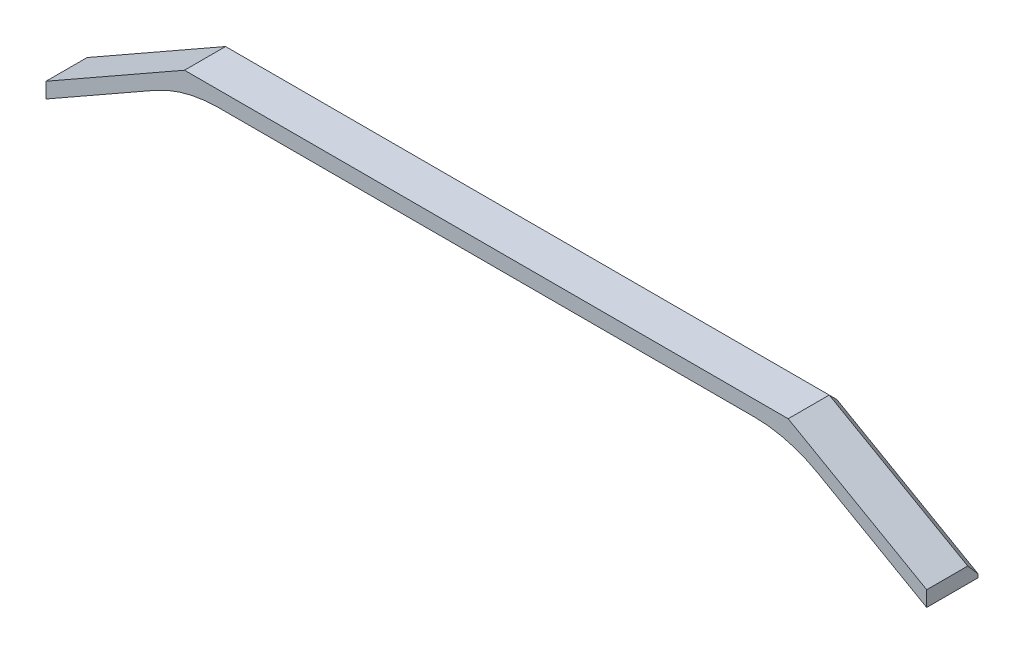
ISO-10303-21;
HEADER;
FILE_DESCRIPTION(('STEP AP214'),'2;1');
FILE_NAME('part.step','',(''),(''),'','','');
FILE_SCHEMA(('AUTOMOTIVE_DESIGN { 1 0 10303 214 1 1 1 1 }'));
ENDSEC;
DATA;
#1=APPLICATION_CONTEXT('core data for automotive mechanical design processes');
#2=APPLICATION_PROTOCOL_DEFINITION('international standard','automotive_design',2000,#1);
#3=PRODUCT_CONTEXT('',#1,'mechanical');
#4=PRODUCT('Part','Part','',(#3));
#5=PRODUCT_RELATED_PRODUCT_CATEGORY('part','',(#4));
#6=PRODUCT_DEFINITION_FORMATION('','',#4);
#7=PRODUCT_DEFINITION_CONTEXT('part definition',#1,'design');
#8=PRODUCT_DEFINITION('design','',#6,#7);
#9=PRODUCT_DEFINITION_SHAPE('','',#8);
#10=(LENGTH_UNIT() NAMED_UNIT(*) SI_UNIT(.MILLI.,.METRE.));
#11=(NAMED_UNIT(*) PLANE_ANGLE_UNIT() SI_UNIT($,.RADIAN.));
#12=(NAMED_UNIT(*) SI_UNIT($,.STERADIAN.) SOLID_ANGLE_UNIT());
#13=UNCERTAINTY_MEASURE_WITH_UNIT(LENGTH_MEASURE(1.E-05),#10,'distance_accuracy_value','');
#14=(GEOMETRIC_REPRESENTATION_CONTEXT(3) GLOBAL_UNCERTAINTY_ASSIGNED_CONTEXT((#13)) GLOBAL_UNIT_ASSIGNED_CONTEXT((#10,
#11,#12)) REPRESENTATION_CONTEXT('',''));
#15=CARTESIAN_POINT('',(0.,0.,0.));
#16=DIRECTION('',(0.,0.,1.));
#17=DIRECTION('',(1.,0.,0.));
#18=AXIS2_PLACEMENT_3D('',#15,#16,#17);
#19=CARTESIAN_POINT('',(-58.8301277383861,3.,-9.99999999999999));
#20=DIRECTION('',(0.,0.,1.));
#21=DIRECTION('',(1.,0.,0.));
#22=AXIS2_PLACEMENT_3D('',#19,#20,#21);
#23=PLANE('',#22);
#24=DIRECTION('',(1.,0.,0.));
#25=VECTOR('',#24,1.);
#26=CARTESIAN_POINT('',(-58.8301277383861,0.999999999999998,-9.99999999999999));
#27=LINE('',#26,#25);
#28=CARTESIAN_POINT('',(-58.3010030599565,0.999999999999998,-9.99999999999999));
#29=VERTEX_POINT('',#28);
#30=CARTESIAN_POINT('',(58.3010030599564,0.999999999999998,-10.));
#31=VERTEX_POINT('',#30);
#32=EDGE_CURVE('E197',#29,#31,#27,.T.);
#33=ORIENTED_EDGE('',*,*,#32,.T.);
#34=DIRECTION('',(0.869170702615036,-0.494512173475725,0.));
#35=VECTOR('',#34,1.);
#36=CARTESIAN_POINT('',(84.8411033914347,-14.0999138140486,-10.));
#37=LINE('',#36,#35);
#38=CARTESIAN_POINT('',(85.8301277383861,-14.6626163740405,-10.));
#39=VERTEX_POINT('',#38);
#40=EDGE_CURVE('E221',#31,#39,#37,.T.);
#41=ORIENTED_EDGE('',*,*,#40,.T.);
#42=DIRECTION('',(0.,1.,0.));
#43=VECTOR('',#42,1.);
#44=CARTESIAN_POINT('',(85.8301277383861,-15.3615724088186,-10.));
#45=LINE('',#44,#43);
#46=CARTESIAN_POINT('',(85.8301277383861,-15.3615724088186,-10.));
#47=VERTEX_POINT('',#46);
#48=EDGE_CURVE('E157',#47,#39,#45,.T.);
#49=ORIENTED_EDGE('',*,*,#48,.F.);
#50=DIRECTION('',(0.869170702615036,-0.494512173475725,0.));
#51=VECTOR('',#50,1.);
#52=CARTESIAN_POINT('',(58.8301277383861,0.,-10.));
#53=LINE('',#52,#51);
#54=CARTESIAN_POINT('',(64.5788735949077,-3.27073243462411,-10.));
#55=VERTEX_POINT('',#54);
#56=EDGE_CURVE('E154',#55,#47,#53,.T.);
#57=ORIENTED_EDGE('',*,*,#56,.F.);
#58=CARTESIAN_POINT('',(52.2160692580145,-25.,-10.));
#59=DIRECTION('',(0.,0.,1.));
#60=DIRECTION('',(1.,0.,0.));
#61=AXIS2_PLACEMENT_3D('',#58,#59,#60);
#62=CIRCLE('',#61,25.);
#63=CARTESIAN_POINT('',(52.2160692580145,0.,-10.));
#64=VERTEX_POINT('',#63);
#65=EDGE_CURVE('E47',#55,#64,#62,.T.);
#66=ORIENTED_EDGE('',*,*,#65,.T.);
#67=DIRECTION('',(-1.,0.,0.));
#68=VECTOR('',#67,1.);
#69=CARTESIAN_POINT('',(-58.8301277383861,0.,-9.99999999999999));
#70=LINE('',#69,#68);
#71=CARTESIAN_POINT('',(-52.2160692580145,0.,-9.99999999999999));
#72=VERTEX_POINT('',#71);
#73=EDGE_CURVE('E184',#64,#72,#70,.T.);
#74=ORIENTED_EDGE('',*,*,#73,.T.);
#75=CARTESIAN_POINT('',(-52.2160692580145,-25.,-9.99999999999999));
#76=DIRECTION('',(0.,0.,1.));
#77=DIRECTION('',(1.,0.,0.));
#78=AXIS2_PLACEMENT_3D('',#75,#76,#77);
#79=CIRCLE('',#78,25.);
#80=CARTESIAN_POINT('',(-64.5788735949077,-3.27073243462411,-10.));
#81=VERTEX_POINT('',#80);
#82=EDGE_CURVE('E240',#72,#81,#79,.T.);
#83=ORIENTED_EDGE('',*,*,#82,.T.);
#84=DIRECTION('',(0.869170702615035,0.494512173475725,0.));
#85=VECTOR('',#84,1.);
#86=CARTESIAN_POINT('',(-58.8301277383861,0.,-10.));
#87=LINE('',#86,#85);
#88=CARTESIAN_POINT('',(-85.8301277383861,-15.3615724088186,-10.));
#89=VERTEX_POINT('',#88);
#90=EDGE_CURVE('E164',#89,#81,#87,.T.);
#91=ORIENTED_EDGE('',*,*,#90,.F.);
#92=DIRECTION('',(0.,-1.,0.));
#93=VECTOR('',#92,1.);
#94=CARTESIAN_POINT('',(-85.8301277383861,-15.3615724088186,-10.));
#95=LINE('',#94,#93);
#96=CARTESIAN_POINT('',(-85.8301277383861,-14.6626163740404,-10.));
#97=VERTEX_POINT('',#96);
#98=EDGE_CURVE('E162',#97,#89,#95,.T.);
#99=ORIENTED_EDGE('',*,*,#98,.F.);
#100=DIRECTION('',(0.869170702615035,0.494512173475725,0.));
#101=VECTOR('',#100,1.);
#102=CARTESIAN_POINT('',(-57.8411033914347,1.26165859476996,-9.99999999999999));
#103=LINE('',#102,#101);
#104=EDGE_CURVE('E219',#97,#29,#103,.T.);
#105=ORIENTED_EDGE('',*,*,#104,.T.);
#106=EDGE_LOOP('',(#33,#41,#49,#57,#66,#74,#83,#91,#99,#105));
#107=FACE_BOUND('',#106,.T.);
#108=ADVANCED_FACE('F39',(#107),#23,.F.);
#109=CARTESIAN_POINT('',(58.8301277383861,3.,0.));
#110=DIRECTION('',(0.,0.,-1.));
#111=DIRECTION('',(-1.,0.,0.));
#112=AXIS2_PLACEMENT_3D('',#109,#110,#111);
#113=PLANE('',#112);
#114=DIRECTION('',(0.869170702615035,0.494512173475725,0.));
#115=VECTOR('',#114,1.);
#116=CARTESIAN_POINT('',(-58.8301277383861,0.,0.));
#117=LINE('',#116,#115);
#118=CARTESIAN_POINT('',(-85.8301277383861,-15.3615724088186,0.));
#119=VERTEX_POINT('',#118);
#120=CARTESIAN_POINT('',(-64.5788735949077,-3.27073243462411,0.));
#121=VERTEX_POINT('',#120);
#122=EDGE_CURVE('E165',#119,#121,#117,.T.);
#123=ORIENTED_EDGE('',*,*,#122,.T.);
#124=CARTESIAN_POINT('',(-52.2160692580145,-25.,0.));
#125=DIRECTION('',(0.,0.,-1.));
#126=DIRECTION('',(-1.,0.,0.));
#127=AXIS2_PLACEMENT_3D('',#124,#125,#126);
#128=CIRCLE('',#127,25.);
#129=CARTESIAN_POINT('',(-52.2160692580145,0.,0.));
#130=VERTEX_POINT('',#129);
#131=EDGE_CURVE('E238',#121,#130,#128,.T.);
#132=ORIENTED_EDGE('',*,*,#131,.T.);
#133=DIRECTION('',(1.,0.,0.));
#134=VECTOR('',#133,1.);
#135=CARTESIAN_POINT('',(58.8301277383861,0.,0.));
#136=LINE('',#135,#134);
#137=CARTESIAN_POINT('',(52.2160692580145,0.,0.));
#138=VERTEX_POINT('',#137);
#139=EDGE_CURVE('E187',#130,#138,#136,.T.);
#140=ORIENTED_EDGE('',*,*,#139,.T.);
#141=CARTESIAN_POINT('',(52.2160692580145,-25.,0.));
#142=DIRECTION('',(0.,0.,-1.));
#143=DIRECTION('',(-1.,0.,0.));
#144=AXIS2_PLACEMENT_3D('',#141,#142,#143);
#145=CIRCLE('',#144,25.);
#146=CARTESIAN_POINT('',(64.5788735949077,-3.27073243462411,0.));
#147=VERTEX_POINT('',#146);
#148=EDGE_CURVE('E11',#138,#147,#145,.T.);
#149=ORIENTED_EDGE('',*,*,#148,.T.);
#150=DIRECTION('',(0.869170702615036,-0.494512173475725,0.));
#151=VECTOR('',#150,1.);
#152=CARTESIAN_POINT('',(58.8301277383861,0.,0.));
#153=LINE('',#152,#151);
#154=CARTESIAN_POINT('',(85.8301277383861,-15.3615724088186,0.));
#155=VERTEX_POINT('',#154);
#156=EDGE_CURVE('E149',#147,#155,#153,.T.);
#157=ORIENTED_EDGE('',*,*,#156,.T.);
#158=DIRECTION('',(0.,1.,0.));
#159=VECTOR('',#158,1.);
#160=CARTESIAN_POINT('',(85.8301277383861,-15.3615724088186,0.));
#161=LINE('',#160,#159);
#162=CARTESIAN_POINT('',(85.8301277383861,-12.3615724088186,0.));
#163=VERTEX_POINT('',#162);
#164=EDGE_CURVE('E133',#155,#163,#161,.T.);
#165=ORIENTED_EDGE('',*,*,#164,.T.);
#166=DIRECTION('',(-0.869170702615035,0.494512173475725,0.));
#167=VECTOR('',#166,1.);
#168=CARTESIAN_POINT('',(85.8301277383861,-12.3615724088186,0.));
#169=LINE('',#168,#167);
#170=CARTESIAN_POINT('',(58.8301277383861,3.,0.));
#171=VERTEX_POINT('',#170);
#172=EDGE_CURVE('E143',#163,#171,#169,.T.);
#173=ORIENTED_EDGE('',*,*,#172,.T.);
#174=DIRECTION('',(1.,0.,0.));
#175=VECTOR('',#174,1.);
#176=CARTESIAN_POINT('',(58.8301277383861,3.,0.));
#177=LINE('',#176,#175);
#178=CARTESIAN_POINT('',(-58.8301277383861,3.,0.));
#179=VERTEX_POINT('',#178);
#180=EDGE_CURVE('E189',#179,#171,#177,.T.);
#181=ORIENTED_EDGE('',*,*,#180,.F.);
#182=DIRECTION('',(-0.869170702615035,-0.494512173475725,0.));
#183=VECTOR('',#182,1.);
#184=CARTESIAN_POINT('',(-85.8301277383861,-12.3615724088186,0.));
#185=LINE('',#184,#183);
#186=CARTESIAN_POINT('',(-85.8301277383861,-12.3615724088186,0.));
#187=VERTEX_POINT('',#186);
#188=EDGE_CURVE('E148',#179,#187,#185,.T.);
#189=ORIENTED_EDGE('',*,*,#188,.T.);
#190=DIRECTION('',(0.,-1.,0.));
#191=VECTOR('',#190,1.);
#192=CARTESIAN_POINT('',(-85.8301277383861,-15.3615724088186,0.));
#193=LINE('',#192,#191);
#194=EDGE_CURVE('E171',#187,#119,#193,.T.);
#195=ORIENTED_EDGE('',*,*,#194,.T.);
#196=EDGE_LOOP('',(#123,#132,#140,#149,#157,#165,#173,#181,#189,#195));
#197=FACE_BOUND('',#196,.T.);
#198=ADVANCED_FACE('F152',(#197),#113,.F.);
#199=CARTESIAN_POINT('',(0.,3.,0.));
#200=DIRECTION('',(0.,-1.,0.));
#201=DIRECTION('',(0.,0.,-1.));
#202=AXIS2_PLACEMENT_3D('',#199,#200,#201);
#203=PLANE('',#202);
#204=DIRECTION('',(0.,0.,-1.));
#205=VECTOR('',#204,1.);
#206=CARTESIAN_POINT('',(58.8301277383861,3.,0.));
#207=LINE('',#206,#205);
#208=CARTESIAN_POINT('',(58.8301277383861,3.,-8.00000000000002));
#209=VERTEX_POINT('',#208);
#210=EDGE_CURVE('E146',#171,#209,#207,.T.);
#211=ORIENTED_EDGE('',*,*,#210,.T.);
#212=DIRECTION('',(-1.,0.,0.));
#213=VECTOR('',#212,1.);
#214=CARTESIAN_POINT('',(0.,3.,-8.));
#215=LINE('',#214,#213);
#216=CARTESIAN_POINT('',(-58.8301277383861,3.,-7.99999999999998));
#217=VERTEX_POINT('',#216);
#218=EDGE_CURVE('E191',#209,#217,#215,.T.);
#219=ORIENTED_EDGE('',*,*,#218,.T.);
#220=DIRECTION('',(0.,0.,1.));
#221=VECTOR('',#220,1.);
#222=CARTESIAN_POINT('',(-58.8301277383861,3.,0.));
#223=LINE('',#222,#221);
#224=EDGE_CURVE('E186',#217,#179,#223,.T.);
#225=ORIENTED_EDGE('',*,*,#224,.T.);
#226=ORIENTED_EDGE('',*,*,#180,.T.);
#227=EDGE_LOOP('',(#211,#219,#225,#226));
#228=FACE_BOUND('',#227,.T.);
#229=ADVANCED_FACE('F262',(#228),#203,.F.);
#230=CARTESIAN_POINT('',(0.,0.,0.));
#231=DIRECTION('',(0.,-1.,0.));
#232=DIRECTION('',(0.,0.,-1.));
#233=AXIS2_PLACEMENT_3D('',#230,#231,#232);
#234=PLANE('',#233);
#235=CARTESIAN_POINT('',(29.,0.,-5.));
#236=DIRECTION('',(0.,-1.,0.));
#237=DIRECTION('',(0.,0.,-1.));
#238=AXIS2_PLACEMENT_3D('',#235,#236,#237);
#239=CIRCLE('',#238,1.5);
#240=CARTESIAN_POINT('',(29.,0.,-6.50000000000001));
#241=VERTEX_POINT('',#240);
#242=EDGE_CURVE('E177',#241,#241,#239,.T.);
#243=ORIENTED_EDGE('',*,*,#242,.F.);
#244=EDGE_LOOP('',(#243));
#245=FACE_BOUND('',#244,.T.);
#246=CARTESIAN_POINT('',(-29.,0.,-5.));
#247=DIRECTION('',(0.,-1.,0.));
#248=DIRECTION('',(0.,0.,-1.));
#249=AXIS2_PLACEMENT_3D('',#246,#247,#248);
#250=CIRCLE('',#249,1.5);
#251=CARTESIAN_POINT('',(-29.,0.,-6.5));
#252=VERTEX_POINT('',#251);
#253=EDGE_CURVE('E181',#252,#252,#250,.T.);
#254=ORIENTED_EDGE('',*,*,#253,.F.);
#255=EDGE_LOOP('',(#254));
#256=FACE_BOUND('',#255,.T.);
#257=ORIENTED_EDGE('',*,*,#139,.F.);
#258=DIRECTION('',(0.,0.,1.));
#259=VECTOR('',#258,1.);
#260=CARTESIAN_POINT('',(-52.2160692580145,0.,-9.99999999999999));
#261=LINE('',#260,#259);
#262=EDGE_CURVE('E234',#130,#72,#261,.F.);
#263=ORIENTED_EDGE('',*,*,#262,.T.);
#264=ORIENTED_EDGE('',*,*,#73,.F.);
#265=DIRECTION('',(0.,0.,-1.));
#266=VECTOR('',#265,1.);
#267=CARTESIAN_POINT('',(52.2160692580145,0.,0.));
#268=LINE('',#267,#266);
#269=EDGE_CURVE('E232',#64,#138,#268,.F.);
#270=ORIENTED_EDGE('',*,*,#269,.T.);
#271=EDGE_LOOP('',(#257,#263,#264,#270));
#272=FACE_BOUND('',#271,.T.);
#273=ADVANCED_FACE('F248',(#245,#256,#272),#234,.T.);
#274=CARTESIAN_POINT('',(0.,3.,-8.));
#275=DIRECTION('',(0.,-0.707106781186548,0.707106781186547));
#276=DIRECTION('',(-1.,0.,0.));
#277=AXIS2_PLACEMENT_3D('',#274,#275,#276);
#278=PLANE('',#277);
#279=ORIENTED_EDGE('',*,*,#218,.F.);
#280=DIRECTION('',(0.183883837783237,0.695049183224506,0.695049183224507));
#281=VECTOR('',#280,1.);
#282=CARTESIAN_POINT('',(56.8408889922441,-4.51897927741947,-15.5189792774195));
#283=LINE('',#282,#281);
#284=EDGE_CURVE('E217',#209,#31,#283,.F.);
#285=ORIENTED_EDGE('',*,*,#284,.T.);
#286=ORIENTED_EDGE('',*,*,#32,.F.);
#287=DIRECTION('',(0.183883837783252,-0.695049183224504,-0.695049183224506));
#288=VECTOR('',#287,1.);
#289=CARTESIAN_POINT('',(-56.8408889922439,-4.51897927742007,-15.5189792774201));
#290=LINE('',#289,#288);
#291=EDGE_CURVE('E214',#29,#217,#290,.F.);
#292=ORIENTED_EDGE('',*,*,#291,.T.);
#293=EDGE_LOOP('',(#279,#285,#286,#292));
#294=FACE_BOUND('',#293,.T.);
#295=ADVANCED_FACE('F258',(#294),#278,.F.);
#296=CARTESIAN_POINT('',(-29.,-2.,-5.));
#297=DIRECTION('',(0.,1.,0.));
#298=DIRECTION('',(0.,0.,1.));
#299=AXIS2_PLACEMENT_3D('',#296,#297,#298);
#300=CYLINDRICAL_SURFACE('',#299,1.5);
#301=CARTESIAN_POINT('',(-29.,-1.70000000000002,-5.));
#302=DIRECTION('',(0.,-1.,0.));
#303=DIRECTION('',(0.,0.,-1.));
#304=AXIS2_PLACEMENT_3D('',#301,#302,#303);
#305=CIRCLE('',#304,1.5);
#306=CARTESIAN_POINT('',(-29.,-1.70000000000002,-6.5));
#307=VERTEX_POINT('',#306);
#308=EDGE_CURVE('E209',#307,#307,#305,.F.);
#309=ORIENTED_EDGE('',*,*,#308,.T.);
#310=EDGE_LOOP('',(#309));
#311=FACE_BOUND('',#310,.T.);
#312=ORIENTED_EDGE('',*,*,#253,.T.);
#313=EDGE_LOOP('',(#312));
#314=FACE_BOUND('',#313,.T.);
#315=ADVANCED_FACE('F304',(#311,#314),#300,.T.);
#316=CARTESIAN_POINT('',(-29.,-2.,-5.));
#317=DIRECTION('',(0.,-1.,0.));
#318=DIRECTION('',(0.,0.,-1.));
#319=AXIS2_PLACEMENT_3D('',#316,#317,#318);
#320=PLANE('',#319);
#321=CARTESIAN_POINT('',(-29.,-2.,-5.));
#322=DIRECTION('',(0.,-1.,0.));
#323=DIRECTION('',(0.,0.,-1.));
#324=AXIS2_PLACEMENT_3D('',#321,#322,#323);
#325=CIRCLE('',#324,1.20000000000001);
#326=CARTESIAN_POINT('',(-29.,-2.,-6.20000000000001));
#327=VERTEX_POINT('',#326);
#328=EDGE_CURVE('E206',#327,#327,#325,.T.);
#329=ORIENTED_EDGE('',*,*,#328,.T.);
#330=EDGE_LOOP('',(#329));
#331=FACE_BOUND('',#330,.T.);
#332=ADVANCED_FACE('F331',(#331),#320,.T.);
#333=CARTESIAN_POINT('',(29.,-2.,-5.));
#334=DIRECTION('',(0.,1.,0.));
#335=DIRECTION('',(0.,0.,1.));
#336=AXIS2_PLACEMENT_3D('',#333,#334,#335);
#337=CYLINDRICAL_SURFACE('',#336,1.5);
#338=CARTESIAN_POINT('',(29.,-1.70000000000001,-5.));
#339=DIRECTION('',(0.,-1.,0.));
#340=DIRECTION('',(0.,0.,-1.));
#341=AXIS2_PLACEMENT_3D('',#338,#339,#340);
#342=CIRCLE('',#341,1.5);
#343=CARTESIAN_POINT('',(29.,-1.70000000000001,-6.50000000000001));
#344=VERTEX_POINT('',#343);
#345=EDGE_CURVE('E203',#344,#344,#342,.F.);
#346=ORIENTED_EDGE('',*,*,#345,.T.);
#347=EDGE_LOOP('',(#346));
#348=FACE_BOUND('',#347,.T.);
#349=ORIENTED_EDGE('',*,*,#242,.T.);
#350=EDGE_LOOP('',(#349));
#351=FACE_BOUND('',#350,.T.);
#352=ADVANCED_FACE('F333',(#348,#351),#337,.T.);
#353=CARTESIAN_POINT('',(29.,-2.,-5.));
#354=DIRECTION('',(0.,-1.,0.));
#355=DIRECTION('',(0.,0.,-1.));
#356=AXIS2_PLACEMENT_3D('',#353,#354,#355);
#357=PLANE('',#356);
#358=CARTESIAN_POINT('',(29.,-2.,-5.));
#359=DIRECTION('',(0.,-1.,0.));
#360=DIRECTION('',(0.,0.,-1.));
#361=AXIS2_PLACEMENT_3D('',#358,#359,#360);
#362=CIRCLE('',#361,1.20000000000001);
#363=CARTESIAN_POINT('',(29.,-2.,-6.20000000000001));
#364=VERTEX_POINT('',#363);
#365=EDGE_CURVE('E200',#364,#364,#362,.T.);
#366=ORIENTED_EDGE('',*,*,#365,.T.);
#367=EDGE_LOOP('',(#366));
#368=FACE_BOUND('',#367,.T.);
#369=ADVANCED_FACE('F312',(#368),#357,.T.);
#370=CARTESIAN_POINT('',(29.,-2.,-5.));
#371=DIRECTION('',(0.,1.,0.));
#372=DIRECTION('',(0.,0.,1.));
#373=AXIS2_PLACEMENT_3D('',#370,#371,#372);
#374=CONICAL_SURFACE('',#373,1.20000000000001,0.785398163397466);
#375=ORIENTED_EDGE('',*,*,#345,.F.);
#376=EDGE_LOOP('',(#375));
#377=FACE_BOUND('',#376,.T.);
#378=ORIENTED_EDGE('',*,*,#365,.F.);
#379=EDGE_LOOP('',(#378));
#380=FACE_BOUND('',#379,.T.);
#381=ADVANCED_FACE('F305',(#377,#380),#374,.T.);
#382=CARTESIAN_POINT('',(-29.,-2.,-5.));
#383=DIRECTION('',(0.,1.,0.));
#384=DIRECTION('',(0.,0.,1.));
#385=AXIS2_PLACEMENT_3D('',#382,#383,#384);
#386=CONICAL_SURFACE('',#385,1.20000000000001,0.785398163397466);
#387=ORIENTED_EDGE('',*,*,#308,.F.);
#388=EDGE_LOOP('',(#387));
#389=FACE_BOUND('',#388,.T.);
#390=ORIENTED_EDGE('',*,*,#328,.F.);
#391=EDGE_LOOP('',(#390));
#392=FACE_BOUND('',#391,.T.);
#393=ADVANCED_FACE('F311',(#389,#392),#386,.T.);
#394=CARTESIAN_POINT('',(-58.8301277383861,0.,-10.));
#395=DIRECTION('',(0.494512173475725,-0.869170702615035,0.));
#396=DIRECTION('',(0.869170702615035,0.494512173475725,0.));
#397=AXIS2_PLACEMENT_3D('',#394,#395,#396);
#398=PLANE('',#397);
#399=ORIENTED_EDGE('',*,*,#90,.T.);
#400=DIRECTION('',(0.,0.,1.));
#401=VECTOR('',#400,1.);
#402=CARTESIAN_POINT('',(-64.5788735949077,-3.27073243462412,0.));
#403=LINE('',#402,#401);
#404=EDGE_CURVE('E229',#81,#121,#403,.T.);
#405=ORIENTED_EDGE('',*,*,#404,.T.);
#406=ORIENTED_EDGE('',*,*,#122,.F.);
#407=DIRECTION('',(0.,0.,1.));
#408=VECTOR('',#407,1.);
#409=CARTESIAN_POINT('',(-85.8301277383861,-15.3615724088186,-10.));
#410=LINE('',#409,#408);
#411=EDGE_CURVE('E175',#89,#119,#410,.T.);
#412=ORIENTED_EDGE('',*,*,#411,.F.);
#413=EDGE_LOOP('',(#399,#405,#406,#412));
#414=FACE_BOUND('',#413,.T.);
#415=ADVANCED_FACE('F273',(#414),#398,.T.);
#416=CARTESIAN_POINT('',(-85.8301277383861,-15.3615724088186,-10.));
#417=DIRECTION('',(-1.,0.,0.));
#418=DIRECTION('',(0.,0.,1.));
#419=AXIS2_PLACEMENT_3D('',#416,#417,#418);
#420=PLANE('',#419);
#421=DIRECTION('',(0.,0.,1.));
#422=VECTOR('',#421,1.);
#423=CARTESIAN_POINT('',(-85.8301277383861,-12.3615724088186,-10.));
#424=LINE('',#423,#422);
#425=CARTESIAN_POINT('',(-85.8301277383861,-12.3615724088186,-8.00000000000001));
#426=VERTEX_POINT('',#425);
#427=EDGE_CURVE('E168',#426,#187,#424,.T.);
#428=ORIENTED_EDGE('',*,*,#427,.F.);
#429=DIRECTION('',(0.,-0.754752941377838,-0.656009144358143));
#430=VECTOR('',#429,1.);
#431=CARTESIAN_POINT('',(-85.8301277383861,-15.0607780789242,-10.3460704887882));
#432=LINE('',#431,#430);
#433=EDGE_CURVE('E227',#426,#97,#432,.T.);
#434=ORIENTED_EDGE('',*,*,#433,.T.);
#435=ORIENTED_EDGE('',*,*,#98,.T.);
#436=ORIENTED_EDGE('',*,*,#411,.T.);
#437=ORIENTED_EDGE('',*,*,#194,.F.);
#438=EDGE_LOOP('',(#428,#434,#435,#436,#437));
#439=FACE_BOUND('',#438,.T.);
#440=ADVANCED_FACE('F269',(#439),#420,.T.);
#441=CARTESIAN_POINT('',(-85.8301277383861,-12.3615724088186,-10.));
#442=DIRECTION('',(-0.494512173475725,0.869170702615035,0.));
#443=DIRECTION('',(-0.869170702615035,-0.494512173475725,0.));
#444=AXIS2_PLACEMENT_3D('',#441,#442,#443);
#445=PLANE('',#444);
#446=ORIENTED_EDGE('',*,*,#224,.F.);
#447=DIRECTION('',(-0.869170702615035,-0.494512173475725,0.));
#448=VECTOR('',#447,1.);
#449=CARTESIAN_POINT('',(-85.8301277383861,-12.3615724088186,-8.00000000000001));
#450=LINE('',#449,#448);
#451=EDGE_CURVE('E224',#217,#426,#450,.T.);
#452=ORIENTED_EDGE('',*,*,#451,.T.);
#453=ORIENTED_EDGE('',*,*,#427,.T.);
#454=ORIENTED_EDGE('',*,*,#188,.F.);
#455=EDGE_LOOP('',(#446,#452,#453,#454));
#456=FACE_BOUND('',#455,.T.);
#457=ADVANCED_FACE('F265',(#456),#445,.T.);
#458=CARTESIAN_POINT('',(85.8301277383861,-12.3615724088186,-10.));
#459=DIRECTION('',(0.494512173475725,0.869170702615036,0.));
#460=DIRECTION('',(-0.869170702615036,0.494512173475725,0.));
#461=AXIS2_PLACEMENT_3D('',#458,#459,#460);
#462=PLANE('',#461);
#463=DIRECTION('',(0.,0.,1.));
#464=VECTOR('',#463,1.);
#465=CARTESIAN_POINT('',(85.8301277383861,-12.3615724088186,-10.));
#466=LINE('',#465,#464);
#467=CARTESIAN_POINT('',(85.8301277383861,-12.3615724088186,-8.));
#468=VERTEX_POINT('',#467);
#469=EDGE_CURVE('E127',#468,#163,#466,.T.);
#470=ORIENTED_EDGE('',*,*,#469,.F.);
#471=DIRECTION('',(-0.869170702615036,0.494512173475725,0.));
#472=VECTOR('',#471,1.);
#473=CARTESIAN_POINT('',(58.8301277383861,3.,-7.99999999999999));
#474=LINE('',#473,#472);
#475=EDGE_CURVE('E212',#468,#209,#474,.T.);
#476=ORIENTED_EDGE('',*,*,#475,.T.);
#477=ORIENTED_EDGE('',*,*,#210,.F.);
#478=ORIENTED_EDGE('',*,*,#172,.F.);
#479=EDGE_LOOP('',(#470,#476,#477,#478));
#480=FACE_BOUND('',#479,.T.);
#481=ADVANCED_FACE('F144',(#480),#462,.T.);
#482=CARTESIAN_POINT('',(85.8301277383861,-15.3615724088186,-10.));
#483=DIRECTION('',(1.,0.,0.));
#484=DIRECTION('',(0.,0.,-1.));
#485=AXIS2_PLACEMENT_3D('',#482,#483,#484);
#486=PLANE('',#485);
#487=ORIENTED_EDGE('',*,*,#48,.T.);
#488=DIRECTION('',(0.,0.754752941377834,0.656009144358147));
#489=VECTOR('',#488,1.);
#490=CARTESIAN_POINT('',(85.8301277383861,-15.0607780789242,-10.3460704887882));
#491=LINE('',#490,#489);
#492=EDGE_CURVE('E135',#39,#468,#491,.T.);
#493=ORIENTED_EDGE('',*,*,#492,.T.);
#494=ORIENTED_EDGE('',*,*,#469,.T.);
#495=ORIENTED_EDGE('',*,*,#164,.F.);
#496=DIRECTION('',(0.,0.,1.));
#497=VECTOR('',#496,1.);
#498=CARTESIAN_POINT('',(85.8301277383861,-15.3615724088186,-10.));
#499=LINE('',#498,#497);
#500=EDGE_CURVE('E139',#47,#155,#499,.T.);
#501=ORIENTED_EDGE('',*,*,#500,.F.);
#502=EDGE_LOOP('',(#487,#493,#494,#495,#501));
#503=FACE_BOUND('',#502,.T.);
#504=ADVANCED_FACE('F130',(#503),#486,.T.);
#505=CARTESIAN_POINT('',(58.8301277383861,0.,-10.));
#506=DIRECTION('',(-0.494512173475725,-0.869170702615036,0.));
#507=DIRECTION('',(0.869170702615036,-0.494512173475725,0.));
#508=AXIS2_PLACEMENT_3D('',#505,#506,#507);
#509=PLANE('',#508);
#510=ORIENTED_EDGE('',*,*,#156,.F.);
#511=DIRECTION('',(0.,0.,-1.));
#512=VECTOR('',#511,1.);
#513=CARTESIAN_POINT('',(64.5788735949077,-3.27073243462411,-10.));
#514=LINE('',#513,#512);
#515=EDGE_CURVE('E236',#147,#55,#514,.T.);
#516=ORIENTED_EDGE('',*,*,#515,.T.);
#517=ORIENTED_EDGE('',*,*,#56,.T.);
#518=ORIENTED_EDGE('',*,*,#500,.T.);
#519=EDGE_LOOP('',(#510,#516,#517,#518));
#520=FACE_BOUND('',#519,.T.);
#521=ADVANCED_FACE('F251',(#520),#509,.T.);
#522=CARTESIAN_POINT('',(85.8301277383861,-12.3615724088186,-8.));
#523=DIRECTION('',(0.349672911243986,0.614596497827772,-0.707106781186542));
#524=DIRECTION('',(0.869170702615036,-0.494512173475725,0.));
#525=AXIS2_PLACEMENT_3D('',#522,#523,#524);
#526=PLANE('',#525);
#527=ORIENTED_EDGE('',*,*,#492,.F.);
#528=ORIENTED_EDGE('',*,*,#40,.F.);
#529=ORIENTED_EDGE('',*,*,#284,.F.);
#530=ORIENTED_EDGE('',*,*,#475,.F.);
#531=EDGE_LOOP('',(#527,#528,#529,#530));
#532=FACE_BOUND('',#531,.T.);
#533=ADVANCED_FACE('F255',(#532),#526,.T.);
#534=CARTESIAN_POINT('',(-85.8301277383861,-12.3615724088186,-8.00000000000001));
#535=DIRECTION('',(-0.349672911243985,0.614596497827769,-0.707106781186546));
#536=DIRECTION('',(0.869170702615035,0.494512173475725,0.));
#537=AXIS2_PLACEMENT_3D('',#534,#535,#536);
#538=PLANE('',#537);
#539=ORIENTED_EDGE('',*,*,#291,.F.);
#540=ORIENTED_EDGE('',*,*,#104,.F.);
#541=ORIENTED_EDGE('',*,*,#433,.F.);
#542=ORIENTED_EDGE('',*,*,#451,.F.);
#543=EDGE_LOOP('',(#539,#540,#541,#542));
#544=FACE_BOUND('',#543,.T.);
#545=ADVANCED_FACE('F281',(#544),#538,.T.);
#546=CARTESIAN_POINT('',(-52.2160692580145,-25.,-10.));
#547=DIRECTION('',(0.,0.,-1.));
#548=DIRECTION('',(-1.,0.,0.));
#549=AXIS2_PLACEMENT_3D('',#546,#547,#548);
#550=CYLINDRICAL_SURFACE('',#549,25.);
#551=ORIENTED_EDGE('',*,*,#82,.F.);
#552=ORIENTED_EDGE('',*,*,#262,.F.);
#553=ORIENTED_EDGE('',*,*,#131,.F.);
#554=ORIENTED_EDGE('',*,*,#404,.F.);
#555=EDGE_LOOP('',(#551,#552,#553,#554));
#556=FACE_BOUND('',#555,.T.);
#557=ADVANCED_FACE('F277',(#556),#550,.F.);
#558=CARTESIAN_POINT('',(52.2160692580145,-25.,-10.));
#559=DIRECTION('',(0.,0.,1.));
#560=DIRECTION('',(1.,0.,0.));
#561=AXIS2_PLACEMENT_3D('',#558,#559,#560);
#562=CYLINDRICAL_SURFACE('',#561,25.);
#563=ORIENTED_EDGE('',*,*,#148,.F.);
#564=ORIENTED_EDGE('',*,*,#269,.F.);
#565=ORIENTED_EDGE('',*,*,#65,.F.);
#566=ORIENTED_EDGE('',*,*,#515,.F.);
#567=EDGE_LOOP('',(#563,#564,#565,#566));
#568=FACE_BOUND('',#567,.T.);
#569=ADVANCED_FACE('F41',(#568),#562,.F.);
#570=CLOSED_SHELL('',(#108,#198,#229,#273,#295,#315,#332,#352,#369,#381,#393,#415,#440,#457,
#481,#504,#521,#533,#545,#557,#569));
#571=MANIFOLD_SOLID_BREP('B2',#570);
#572=ADVANCED_BREP_SHAPE_REPRESENTATION('',(#18,#571),#14);
#573=SHAPE_DEFINITION_REPRESENTATION(#9,#572);
ENDSEC;
END-ISO-10303-21;
